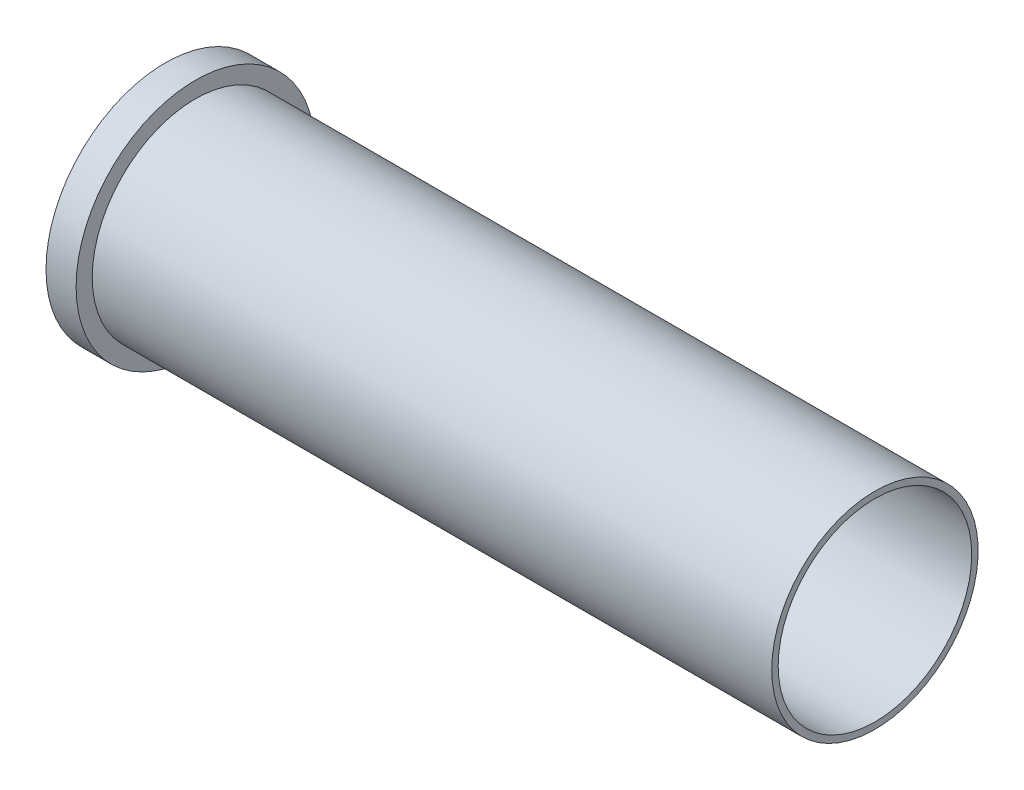
ISO-10303-21;
HEADER;
FILE_DESCRIPTION(('STEP AP214'),'2;1');
FILE_NAME('part.step','',(''),(''),'','','');
FILE_SCHEMA(('AUTOMOTIVE_DESIGN { 1 0 10303 214 1 1 1 1 }'));
ENDSEC;
DATA;
#1=APPLICATION_CONTEXT('core data for automotive mechanical design processes');
#2=APPLICATION_PROTOCOL_DEFINITION('international standard','automotive_design',2000,#1);
#3=PRODUCT_CONTEXT('',#1,'mechanical');
#4=PRODUCT('Part','Part','',(#3));
#5=PRODUCT_RELATED_PRODUCT_CATEGORY('part','',(#4));
#6=PRODUCT_DEFINITION_FORMATION('','',#4);
#7=PRODUCT_DEFINITION_CONTEXT('part definition',#1,'design');
#8=PRODUCT_DEFINITION('design','',#6,#7);
#9=PRODUCT_DEFINITION_SHAPE('','',#8);
#10=(LENGTH_UNIT() NAMED_UNIT(*) SI_UNIT(.MILLI.,.METRE.));
#11=(NAMED_UNIT(*) PLANE_ANGLE_UNIT() SI_UNIT($,.RADIAN.));
#12=(NAMED_UNIT(*) SI_UNIT($,.STERADIAN.) SOLID_ANGLE_UNIT());
#13=UNCERTAINTY_MEASURE_WITH_UNIT(LENGTH_MEASURE(1.E-05),#10,'distance_accuracy_value','');
#14=(GEOMETRIC_REPRESENTATION_CONTEXT(3) GLOBAL_UNCERTAINTY_ASSIGNED_CONTEXT((#13)) GLOBAL_UNIT_ASSIGNED_CONTEXT((#10,
#11,#12)) REPRESENTATION_CONTEXT('',''));
#15=CARTESIAN_POINT('',(0.,0.,0.));
#16=DIRECTION('',(0.,0.,1.));
#17=DIRECTION('',(1.,0.,0.));
#18=AXIS2_PLACEMENT_3D('',#15,#16,#17);
#19=CARTESIAN_POINT('',(3.8,0.,-4.5));
#20=DIRECTION('',(-1.,0.,0.));
#21=DIRECTION('',(0.,0.,1.));
#22=AXIS2_PLACEMENT_3D('',#19,#20,#21);
#23=PLANE('',#22);
#24=CARTESIAN_POINT('',(3.8,0.,0.));
#25=DIRECTION('',(-1.,0.,0.));
#26=DIRECTION('',(0.,0.,1.));
#27=AXIS2_PLACEMENT_3D('',#24,#25,#26);
#28=CIRCLE('',#27,4.5);
#29=CARTESIAN_POINT('',(3.8,0.,4.5));
#30=VERTEX_POINT('',#29);
#31=EDGE_CURVE('E76',#30,#30,#28,.T.);
#32=ORIENTED_EDGE('',*,*,#31,.F.);
#33=EDGE_LOOP('',(#32));
#34=FACE_BOUND('',#33,.T.);
#35=CARTESIAN_POINT('',(3.8,0.,0.));
#36=DIRECTION('',(-1.,0.,0.));
#37=DIRECTION('',(0.,0.,1.));
#38=AXIS2_PLACEMENT_3D('',#35,#36,#37);
#39=CIRCLE('',#38,1.05);
#40=CARTESIAN_POINT('',(3.8,0.,1.05));
#41=VERTEX_POINT('',#40);
#42=EDGE_CURVE('E12',#41,#41,#39,.T.);
#43=ORIENTED_EDGE('',*,*,#42,.T.);
#44=EDGE_LOOP('',(#43));
#45=FACE_BOUND('',#44,.T.);
#46=ADVANCED_FACE('F42',(#34,#45),#23,.F.);
#47=CARTESIAN_POINT('',(0.,0.,0.));
#48=DIRECTION('',(-1.,0.,0.));
#49=DIRECTION('',(0.,0.,1.));
#50=AXIS2_PLACEMENT_3D('',#47,#48,#49);
#51=CYLINDRICAL_SURFACE('',#50,1.05);
#52=ORIENTED_EDGE('',*,*,#42,.F.);
#53=EDGE_LOOP('',(#52));
#54=FACE_BOUND('',#53,.T.);
#55=CARTESIAN_POINT('',(2.96039870592834,0.,0.));
#56=DIRECTION('',(-1.,0.,0.));
#57=DIRECTION('',(0.,0.,1.));
#58=AXIS2_PLACEMENT_3D('',#55,#56,#57);
#59=CIRCLE('',#58,1.05);
#60=CARTESIAN_POINT('',(2.96039870592834,0.,1.05));
#61=VERTEX_POINT('',#60);
#62=EDGE_CURVE('E48',#61,#61,#59,.T.);
#63=ORIENTED_EDGE('',*,*,#62,.T.);
#64=EDGE_LOOP('',(#63));
#65=FACE_BOUND('',#64,.T.);
#66=ADVANCED_FACE('F83',(#54,#65),#51,.F.);
#67=CARTESIAN_POINT('',(2.96039870592834,0.,-1.05));
#68=DIRECTION('',(1.,0.,0.));
#69=DIRECTION('',(0.,0.,-1.));
#70=AXIS2_PLACEMENT_3D('',#67,#68,#69);
#71=PLANE('',#70);
#72=ORIENTED_EDGE('',*,*,#62,.F.);
#73=EDGE_LOOP('',(#72));
#74=FACE_BOUND('',#73,.T.);
#75=CARTESIAN_POINT('',(2.96039870592834,0.,0.));
#76=DIRECTION('',(-1.,0.,0.));
#77=DIRECTION('',(0.,0.,1.));
#78=AXIS2_PLACEMENT_3D('',#75,#76,#77);
#79=CIRCLE('',#78,2.25);
#80=CARTESIAN_POINT('',(2.96039870592834,0.,2.25));
#81=VERTEX_POINT('',#80);
#82=EDGE_CURVE('E52',#81,#81,#79,.T.);
#83=ORIENTED_EDGE('',*,*,#82,.T.);
#84=EDGE_LOOP('',(#83));
#85=FACE_BOUND('',#84,.T.);
#86=ADVANCED_FACE('F87',(#74,#85),#71,.F.);
#87=CARTESIAN_POINT('',(0.,0.,0.));
#88=DIRECTION('',(-1.,0.,0.));
#89=DIRECTION('',(0.,0.,1.));
#90=AXIS2_PLACEMENT_3D('',#87,#88,#89);
#91=CYLINDRICAL_SURFACE('',#90,2.25);
#92=ORIENTED_EDGE('',*,*,#82,.F.);
#93=EDGE_LOOP('',(#92));
#94=FACE_BOUND('',#93,.T.);
#95=CARTESIAN_POINT('',(0.,0.,0.));
#96=DIRECTION('',(-1.,0.,0.));
#97=DIRECTION('',(0.,0.,1.));
#98=AXIS2_PLACEMENT_3D('',#95,#96,#97);
#99=CIRCLE('',#98,2.25);
#100=CARTESIAN_POINT('',(0.,0.,2.25));
#101=VERTEX_POINT('',#100);
#102=EDGE_CURVE('E56',#101,#101,#99,.T.);
#103=ORIENTED_EDGE('',*,*,#102,.T.);
#104=EDGE_LOOP('',(#103));
#105=FACE_BOUND('',#104,.T.);
#106=ADVANCED_FACE('F92',(#94,#105),#91,.F.);
#107=CARTESIAN_POINT('',(0.,0.,-2.25));
#108=DIRECTION('',(1.,0.,0.));
#109=DIRECTION('',(0.,0.,-1.));
#110=AXIS2_PLACEMENT_3D('',#107,#108,#109);
#111=PLANE('',#110);
#112=ORIENTED_EDGE('',*,*,#102,.F.);
#113=EDGE_LOOP('',(#112));
#114=FACE_BOUND('',#113,.T.);
#115=CARTESIAN_POINT('',(0.,0.,0.));
#116=DIRECTION('',(-1.,0.,0.));
#117=DIRECTION('',(0.,0.,1.));
#118=AXIS2_PLACEMENT_3D('',#115,#116,#117);
#119=CIRCLE('',#118,5.55);
#120=CARTESIAN_POINT('',(0.,0.,5.55));
#121=VERTEX_POINT('',#120);
#122=EDGE_CURVE('E61',#121,#121,#119,.T.);
#123=ORIENTED_EDGE('',*,*,#122,.T.);
#124=EDGE_LOOP('',(#123));
#125=FACE_BOUND('',#124,.T.);
#126=ADVANCED_FACE('F98',(#114,#125),#111,.F.);
#127=CARTESIAN_POINT('',(0.,0.,0.));
#128=DIRECTION('',(-1.,0.,0.));
#129=DIRECTION('',(0.,0.,1.));
#130=AXIS2_PLACEMENT_3D('',#127,#128,#129);
#131=CYLINDRICAL_SURFACE('',#130,5.55);
#132=ORIENTED_EDGE('',*,*,#122,.F.);
#133=EDGE_LOOP('',(#132));
#134=FACE_BOUND('',#133,.T.);
#135=CARTESIAN_POINT('',(1.4,0.,0.));
#136=DIRECTION('',(-1.,0.,0.));
#137=DIRECTION('',(0.,0.,1.));
#138=AXIS2_PLACEMENT_3D('',#135,#136,#137);
#139=CIRCLE('',#138,5.55);
#140=CARTESIAN_POINT('',(1.4,0.,5.55));
#141=VERTEX_POINT('',#140);
#142=EDGE_CURVE('E64',#141,#141,#139,.T.);
#143=ORIENTED_EDGE('',*,*,#142,.T.);
#144=EDGE_LOOP('',(#143));
#145=FACE_BOUND('',#144,.T.);
#146=ADVANCED_FACE('F102',(#134,#145),#131,.T.);
#147=CARTESIAN_POINT('',(1.4,0.,-5.55));
#148=DIRECTION('',(-1.,0.,0.));
#149=DIRECTION('',(0.,0.,1.));
#150=AXIS2_PLACEMENT_3D('',#147,#148,#149);
#151=PLANE('',#150);
#152=ORIENTED_EDGE('',*,*,#142,.F.);
#153=EDGE_LOOP('',(#152));
#154=FACE_BOUND('',#153,.T.);
#155=CARTESIAN_POINT('',(1.4,0.,0.));
#156=DIRECTION('',(-1.,0.,0.));
#157=DIRECTION('',(0.,0.,1.));
#158=AXIS2_PLACEMENT_3D('',#155,#156,#157);
#159=CIRCLE('',#158,4.8);
#160=CARTESIAN_POINT('',(1.4,0.,4.8));
#161=VERTEX_POINT('',#160);
#162=EDGE_CURVE('E67',#161,#161,#159,.T.);
#163=ORIENTED_EDGE('',*,*,#162,.T.);
#164=EDGE_LOOP('',(#163));
#165=FACE_BOUND('',#164,.T.);
#166=ADVANCED_FACE('F106',(#154,#165),#151,.F.);
#167=CARTESIAN_POINT('',(0.,0.,0.));
#168=DIRECTION('',(-1.,0.,0.));
#169=DIRECTION('',(0.,0.,1.));
#170=AXIS2_PLACEMENT_3D('',#167,#168,#169);
#171=CYLINDRICAL_SURFACE('',#170,4.8);
#172=ORIENTED_EDGE('',*,*,#162,.F.);
#173=EDGE_LOOP('',(#172));
#174=FACE_BOUND('',#173,.T.);
#175=CARTESIAN_POINT('',(33.,0.,0.));
#176=DIRECTION('',(-1.,0.,0.));
#177=DIRECTION('',(0.,0.,1.));
#178=AXIS2_PLACEMENT_3D('',#175,#176,#177);
#179=CIRCLE('',#178,4.8);
#180=CARTESIAN_POINT('',(33.,0.,4.8));
#181=VERTEX_POINT('',#180);
#182=EDGE_CURVE('E70',#181,#181,#179,.T.);
#183=ORIENTED_EDGE('',*,*,#182,.T.);
#184=EDGE_LOOP('',(#183));
#185=FACE_BOUND('',#184,.T.);
#186=ADVANCED_FACE('F110',(#174,#185),#171,.T.);
#187=CARTESIAN_POINT('',(33.,0.,-4.8));
#188=DIRECTION('',(-1.,0.,0.));
#189=DIRECTION('',(0.,0.,1.));
#190=AXIS2_PLACEMENT_3D('',#187,#188,#189);
#191=PLANE('',#190);
#192=ORIENTED_EDGE('',*,*,#182,.F.);
#193=EDGE_LOOP('',(#192));
#194=FACE_BOUND('',#193,.T.);
#195=CARTESIAN_POINT('',(33.,0.,0.));
#196=DIRECTION('',(-1.,0.,0.));
#197=DIRECTION('',(0.,0.,1.));
#198=AXIS2_PLACEMENT_3D('',#195,#196,#197);
#199=CIRCLE('',#198,4.50000000000001);
#200=CARTESIAN_POINT('',(33.,0.,4.50000000000001));
#201=VERTEX_POINT('',#200);
#202=EDGE_CURVE('E73',#201,#201,#199,.T.);
#203=ORIENTED_EDGE('',*,*,#202,.T.);
#204=EDGE_LOOP('',(#203));
#205=FACE_BOUND('',#204,.T.);
#206=ADVANCED_FACE('F114',(#194,#205),#191,.F.);
#207=CARTESIAN_POINT('',(0.,0.,0.));
#208=DIRECTION('',(-1.,0.,0.));
#209=DIRECTION('',(0.,0.,1.));
#210=AXIS2_PLACEMENT_3D('',#207,#208,#209);
#211=CYLINDRICAL_SURFACE('',#210,4.5);
#212=ORIENTED_EDGE('',*,*,#202,.F.);
#213=EDGE_LOOP('',(#212));
#214=FACE_BOUND('',#213,.T.);
#215=ORIENTED_EDGE('',*,*,#31,.T.);
#216=EDGE_LOOP('',(#215));
#217=FACE_BOUND('',#216,.T.);
#218=ADVANCED_FACE('F80',(#214,#217),#211,.F.);
#219=CLOSED_SHELL('',(#46,#66,#86,#106,#126,#146,#166,#186,#206,#218));
#220=MANIFOLD_SOLID_BREP('B2',#219);
#221=ADVANCED_BREP_SHAPE_REPRESENTATION('',(#18,#220),#14);
#222=SHAPE_DEFINITION_REPRESENTATION(#9,#221);
ENDSEC;
END-ISO-10303-21;
